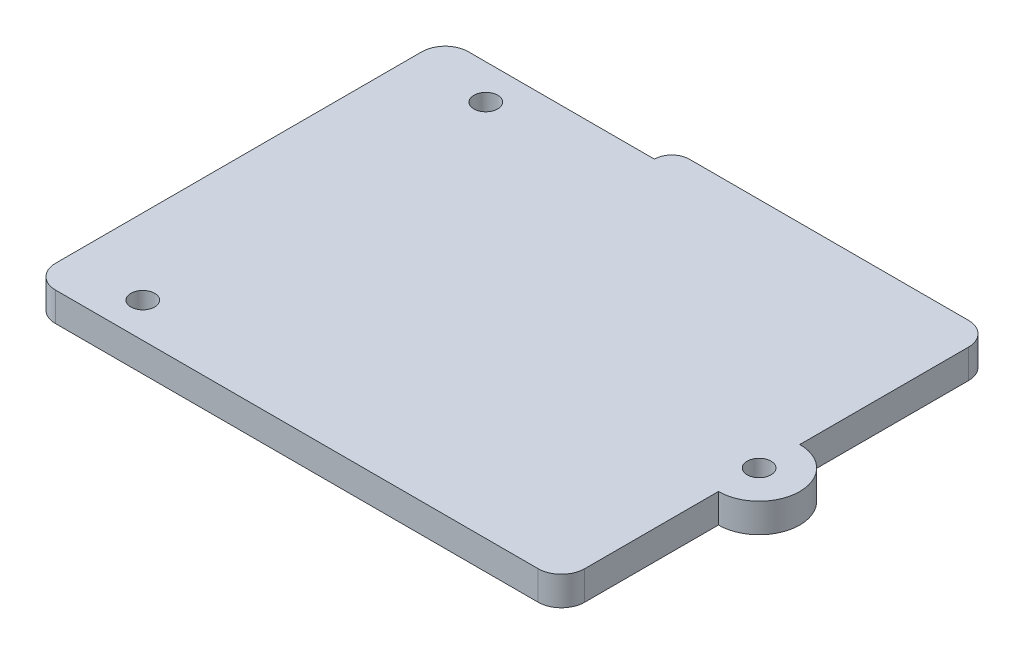
ISO-10303-21;
HEADER;
FILE_DESCRIPTION(('STEP AP214'),'2;1');
FILE_NAME('part.step','',(''),(''),'','','');
FILE_SCHEMA(('AUTOMOTIVE_DESIGN { 1 0 10303 214 1 1 1 1 }'));
ENDSEC;
DATA;
#1=APPLICATION_CONTEXT('core data for automotive mechanical design processes');
#2=APPLICATION_PROTOCOL_DEFINITION('international standard','automotive_design',2000,#1);
#3=PRODUCT_CONTEXT('',#1,'mechanical');
#4=PRODUCT('Part','Part','',(#3));
#5=PRODUCT_RELATED_PRODUCT_CATEGORY('part','',(#4));
#6=PRODUCT_DEFINITION_FORMATION('','',#4);
#7=PRODUCT_DEFINITION_CONTEXT('part definition',#1,'design');
#8=PRODUCT_DEFINITION('design','',#6,#7);
#9=PRODUCT_DEFINITION_SHAPE('','',#8);
#10=(LENGTH_UNIT() NAMED_UNIT(*) SI_UNIT(.MILLI.,.METRE.));
#11=(NAMED_UNIT(*) PLANE_ANGLE_UNIT() SI_UNIT($,.RADIAN.));
#12=(NAMED_UNIT(*) SI_UNIT($,.STERADIAN.) SOLID_ANGLE_UNIT());
#13=UNCERTAINTY_MEASURE_WITH_UNIT(LENGTH_MEASURE(1.E-05),#10,'distance_accuracy_value','');
#14=(GEOMETRIC_REPRESENTATION_CONTEXT(3) GLOBAL_UNCERTAINTY_ASSIGNED_CONTEXT((#13)) GLOBAL_UNIT_ASSIGNED_CONTEXT((#10,
#11,#12)) REPRESENTATION_CONTEXT('',''));
#15=CARTESIAN_POINT('',(0.,0.,0.));
#16=DIRECTION('',(0.,0.,1.));
#17=DIRECTION('',(1.,0.,0.));
#18=AXIS2_PLACEMENT_3D('',#15,#16,#17);
#19=CARTESIAN_POINT('',(45.5,2.5,-17.));
#20=DIRECTION('',(0.,1.,0.));
#21=DIRECTION('',(0.,0.,1.));
#22=AXIS2_PLACEMENT_3D('',#19,#20,#21);
#23=PLANE('',#22);
#24=CARTESIAN_POINT('',(6.5,2.5,-32.5));
#25=DIRECTION('',(0.,1.,0.));
#26=DIRECTION('',(0.,0.,1.));
#27=AXIS2_PLACEMENT_3D('',#24,#25,#26);
#28=CIRCLE('',#27,1.02499999999999);
#29=CARTESIAN_POINT('',(6.5,2.5,-31.475));
#30=VERTEX_POINT('',#29);
#31=EDGE_CURVE('E359',#30,#30,#28,.T.);
#32=ORIENTED_EDGE('',*,*,#31,.F.);
#33=EDGE_LOOP('',(#32));
#34=FACE_BOUND('',#33,.T.);
#35=CARTESIAN_POINT('',(6.5,2.5,-3.));
#36=DIRECTION('',(0.,1.,0.));
#37=DIRECTION('',(0.,0.,1.));
#38=AXIS2_PLACEMENT_3D('',#35,#36,#37);
#39=CIRCLE('',#38,1.02499999999999);
#40=CARTESIAN_POINT('',(6.5,2.5,-1.97500000000001));
#41=VERTEX_POINT('',#40);
#42=EDGE_CURVE('E353',#41,#41,#39,.T.);
#43=ORIENTED_EDGE('',*,*,#42,.F.);
#44=EDGE_LOOP('',(#43));
#45=FACE_BOUND('',#44,.T.);
#46=CARTESIAN_POINT('',(45.5,2.5,-17.));
#47=DIRECTION('',(0.,1.,0.));
#48=DIRECTION('',(0.,0.,1.));
#49=AXIS2_PLACEMENT_3D('',#46,#47,#48);
#50=CIRCLE('',#49,1.02499999999998);
#51=CARTESIAN_POINT('',(45.5,2.5,-15.975));
#52=VERTEX_POINT('',#51);
#53=EDGE_CURVE('E346',#52,#52,#50,.T.);
#54=ORIENTED_EDGE('',*,*,#53,.F.);
#55=EDGE_LOOP('',(#54));
#56=FACE_BOUND('',#55,.T.);
#57=DIRECTION('',(-1.,0.,0.));
#58=VECTOR('',#57,1.);
#59=CARTESIAN_POINT('',(45.5,2.5,-37.));
#60=LINE('',#59,#58);
#61=CARTESIAN_POINT('',(43.5,2.5,-37.));
#62=VERTEX_POINT('',#61);
#63=CARTESIAN_POINT('',(19.5,2.5,-37.));
#64=VERTEX_POINT('',#63);
#65=EDGE_CURVE('E245',#62,#64,#60,.T.);
#66=ORIENTED_EDGE('',*,*,#65,.T.);
#67=CARTESIAN_POINT('',(19.5,2.5,-35.5));
#68=DIRECTION('',(0.,1.,0.));
#69=DIRECTION('',(0.,0.,1.));
#70=AXIS2_PLACEMENT_3D('',#67,#68,#69);
#71=CIRCLE('',#70,1.5);
#72=CARTESIAN_POINT('',(18.,2.5,-35.5));
#73=VERTEX_POINT('',#72);
#74=EDGE_CURVE('E12',#64,#73,#71,.T.);
#75=ORIENTED_EDGE('',*,*,#74,.T.);
#76=DIRECTION('',(-1.,0.,0.));
#77=VECTOR('',#76,1.);
#78=CARTESIAN_POINT('',(18.,2.5,-35.5));
#79=LINE('',#78,#77);
#80=CARTESIAN_POINT('',(2.,2.5,-35.5));
#81=VERTEX_POINT('',#80);
#82=EDGE_CURVE('E250',#73,#81,#79,.T.);
#83=ORIENTED_EDGE('',*,*,#82,.T.);
#84=CARTESIAN_POINT('',(2.,2.5,-33.5));
#85=DIRECTION('',(0.,1.,0.));
#86=DIRECTION('',(0.,0.,1.));
#87=AXIS2_PLACEMENT_3D('',#84,#85,#86);
#88=CIRCLE('',#87,2.);
#89=CARTESIAN_POINT('',(0.,2.5,-33.5));
#90=VERTEX_POINT('',#89);
#91=EDGE_CURVE('E290',#81,#90,#88,.T.);
#92=ORIENTED_EDGE('',*,*,#91,.T.);
#93=DIRECTION('',(0.,0.,1.));
#94=VECTOR('',#93,1.);
#95=CARTESIAN_POINT('',(0.,2.5,-35.5));
#96=LINE('',#95,#94);
#97=CARTESIAN_POINT('',(0.,2.5,-2.));
#98=VERTEX_POINT('',#97);
#99=EDGE_CURVE('E273',#90,#98,#96,.T.);
#100=ORIENTED_EDGE('',*,*,#99,.T.);
#101=CARTESIAN_POINT('',(2.,2.5,-2.));
#102=DIRECTION('',(0.,1.,0.));
#103=DIRECTION('',(0.,0.,1.));
#104=AXIS2_PLACEMENT_3D('',#101,#102,#103);
#105=CIRCLE('',#104,2.);
#106=CARTESIAN_POINT('',(2.,2.5,0.));
#107=VERTEX_POINT('',#106);
#108=EDGE_CURVE('E292',#98,#107,#105,.T.);
#109=ORIENTED_EDGE('',*,*,#108,.T.);
#110=DIRECTION('',(1.,0.,0.));
#111=VECTOR('',#110,1.);
#112=CARTESIAN_POINT('',(0.,2.5,0.));
#113=LINE('',#112,#111);
#114=CARTESIAN_POINT('',(43.5,2.5,0.));
#115=VERTEX_POINT('',#114);
#116=EDGE_CURVE('E225',#107,#115,#113,.T.);
#117=ORIENTED_EDGE('',*,*,#116,.T.);
#118=CARTESIAN_POINT('',(43.5,2.5,-2.));
#119=DIRECTION('',(0.,1.,0.));
#120=DIRECTION('',(0.,0.,1.));
#121=AXIS2_PLACEMENT_3D('',#118,#119,#120);
#122=CIRCLE('',#121,2.);
#123=CARTESIAN_POINT('',(45.5,2.5,-2.));
#124=VERTEX_POINT('',#123);
#125=EDGE_CURVE('E221',#115,#124,#122,.T.);
#126=ORIENTED_EDGE('',*,*,#125,.T.);
#127=DIRECTION('',(0.,0.,-1.));
#128=VECTOR('',#127,1.);
#129=CARTESIAN_POINT('',(45.5,2.5,0.));
#130=LINE('',#129,#128);
#131=CARTESIAN_POINT('',(45.5,2.5,-13.5));
#132=VERTEX_POINT('',#131);
#133=EDGE_CURVE('E213',#124,#132,#130,.T.);
#134=ORIENTED_EDGE('',*,*,#133,.T.);
#135=CARTESIAN_POINT('',(45.5,2.5,-17.));
#136=DIRECTION('',(0.,1.,0.));
#137=DIRECTION('',(0.,0.,1.));
#138=AXIS2_PLACEMENT_3D('',#135,#136,#137);
#139=CIRCLE('',#138,3.5);
#140=CARTESIAN_POINT('',(45.5,2.5,-20.5));
#141=VERTEX_POINT('',#140);
#142=EDGE_CURVE('E217',#132,#141,#139,.T.);
#143=ORIENTED_EDGE('',*,*,#142,.T.);
#144=DIRECTION('',(0.,0.,-1.));
#145=VECTOR('',#144,1.);
#146=CARTESIAN_POINT('',(45.5,2.5,-20.5));
#147=LINE('',#146,#145);
#148=CARTESIAN_POINT('',(45.5,2.5,-35.));
#149=VERTEX_POINT('',#148);
#150=EDGE_CURVE('E241',#141,#149,#147,.T.);
#151=ORIENTED_EDGE('',*,*,#150,.T.);
#152=CARTESIAN_POINT('',(43.5,2.5,-35.));
#153=DIRECTION('',(0.,1.,0.));
#154=DIRECTION('',(0.,0.,1.));
#155=AXIS2_PLACEMENT_3D('',#152,#153,#154);
#156=CIRCLE('',#155,2.);
#157=EDGE_CURVE('E296',#149,#62,#156,.T.);
#158=ORIENTED_EDGE('',*,*,#157,.T.);
#159=EDGE_LOOP('',(#66,#75,#83,#92,#100,#109,#117,#126,#134,#143,#151,#158));
#160=FACE_BOUND('',#159,.T.);
#161=ADVANCED_FACE('F121',(#34,#45,#56,#160),#23,.T.);
#162=CARTESIAN_POINT('',(45.5,0.,-17.));
#163=DIRECTION('',(0.,1.,0.));
#164=DIRECTION('',(0.,0.,1.));
#165=AXIS2_PLACEMENT_3D('',#162,#163,#164);
#166=PLANE('',#165);
#167=CARTESIAN_POINT('',(6.5,0.,-32.5));
#168=DIRECTION('',(0.,1.,0.));
#169=DIRECTION('',(0.,0.,1.));
#170=AXIS2_PLACEMENT_3D('',#167,#168,#169);
#171=CIRCLE('',#170,1.025);
#172=CARTESIAN_POINT('',(6.5,0.,-31.475));
#173=VERTEX_POINT('',#172);
#174=EDGE_CURVE('E356',#173,#173,#171,.T.);
#175=ORIENTED_EDGE('',*,*,#174,.T.);
#176=EDGE_LOOP('',(#175));
#177=FACE_BOUND('',#176,.T.);
#178=CARTESIAN_POINT('',(6.5,0.,-3.));
#179=DIRECTION('',(0.,1.,0.));
#180=DIRECTION('',(0.,0.,1.));
#181=AXIS2_PLACEMENT_3D('',#178,#179,#180);
#182=CIRCLE('',#181,1.025);
#183=CARTESIAN_POINT('',(6.5,0.,-1.975));
#184=VERTEX_POINT('',#183);
#185=EDGE_CURVE('E349',#184,#184,#182,.T.);
#186=ORIENTED_EDGE('',*,*,#185,.T.);
#187=EDGE_LOOP('',(#186));
#188=FACE_BOUND('',#187,.T.);
#189=CARTESIAN_POINT('',(45.5,0.,-17.));
#190=DIRECTION('',(0.,1.,0.));
#191=DIRECTION('',(0.,0.,1.));
#192=AXIS2_PLACEMENT_3D('',#189,#190,#191);
#193=CIRCLE('',#192,1.025);
#194=CARTESIAN_POINT('',(45.5,0.,-15.975));
#195=VERTEX_POINT('',#194);
#196=EDGE_CURVE('E258',#195,#195,#193,.T.);
#197=ORIENTED_EDGE('',*,*,#196,.T.);
#198=EDGE_LOOP('',(#197));
#199=FACE_BOUND('',#198,.T.);
#200=DIRECTION('',(-1.,0.,0.));
#201=VECTOR('',#200,1.);
#202=CARTESIAN_POINT('',(18.,0.,-35.5));
#203=LINE('',#202,#201);
#204=CARTESIAN_POINT('',(18.,0.,-35.5));
#205=VERTEX_POINT('',#204);
#206=CARTESIAN_POINT('',(2.,0.,-35.5));
#207=VERTEX_POINT('',#206);
#208=EDGE_CURVE('E270',#205,#207,#203,.T.);
#209=ORIENTED_EDGE('',*,*,#208,.F.);
#210=CARTESIAN_POINT('',(19.5,0.,-35.5));
#211=DIRECTION('',(0.,1.,0.));
#212=DIRECTION('',(0.,0.,1.));
#213=AXIS2_PLACEMENT_3D('',#210,#211,#212);
#214=CIRCLE('',#213,1.5);
#215=CARTESIAN_POINT('',(19.5,0.,-37.));
#216=VERTEX_POINT('',#215);
#217=EDGE_CURVE('E143',#205,#216,#214,.F.);
#218=ORIENTED_EDGE('',*,*,#217,.T.);
#219=DIRECTION('',(-1.,0.,0.));
#220=VECTOR('',#219,1.);
#221=CARTESIAN_POINT('',(45.5,0.,-37.));
#222=LINE('',#221,#220);
#223=CARTESIAN_POINT('',(43.5,0.,-37.));
#224=VERTEX_POINT('',#223);
#225=EDGE_CURVE('E268',#224,#216,#222,.T.);
#226=ORIENTED_EDGE('',*,*,#225,.F.);
#227=CARTESIAN_POINT('',(43.5,0.,-35.));
#228=DIRECTION('',(0.,1.,0.));
#229=DIRECTION('',(0.,0.,1.));
#230=AXIS2_PLACEMENT_3D('',#227,#228,#229);
#231=CIRCLE('',#230,2.);
#232=CARTESIAN_POINT('',(45.5,0.,-35.));
#233=VERTEX_POINT('',#232);
#234=EDGE_CURVE('E286',#224,#233,#231,.F.);
#235=ORIENTED_EDGE('',*,*,#234,.T.);
#236=DIRECTION('',(0.,0.,-1.));
#237=VECTOR('',#236,1.);
#238=CARTESIAN_POINT('',(45.5,0.,-20.5));
#239=LINE('',#238,#237);
#240=CARTESIAN_POINT('',(45.5,0.,-20.5));
#241=VERTEX_POINT('',#240);
#242=EDGE_CURVE('E265',#241,#233,#239,.T.);
#243=ORIENTED_EDGE('',*,*,#242,.F.);
#244=CARTESIAN_POINT('',(45.5,0.,-17.));
#245=DIRECTION('',(0.,1.,0.));
#246=DIRECTION('',(0.,0.,1.));
#247=AXIS2_PLACEMENT_3D('',#244,#245,#246);
#248=CIRCLE('',#247,3.5);
#249=CARTESIAN_POINT('',(45.5,0.,-13.5));
#250=VERTEX_POINT('',#249);
#251=EDGE_CURVE('E263',#250,#241,#248,.T.);
#252=ORIENTED_EDGE('',*,*,#251,.F.);
#253=DIRECTION('',(0.,0.,-1.));
#254=VECTOR('',#253,1.);
#255=CARTESIAN_POINT('',(45.5,0.,0.));
#256=LINE('',#255,#254);
#257=CARTESIAN_POINT('',(45.5,0.,-2.));
#258=VERTEX_POINT('',#257);
#259=EDGE_CURVE('E231',#258,#250,#256,.T.);
#260=ORIENTED_EDGE('',*,*,#259,.F.);
#261=CARTESIAN_POINT('',(43.5,0.,-2.));
#262=DIRECTION('',(0.,1.,0.));
#263=DIRECTION('',(0.,0.,1.));
#264=AXIS2_PLACEMENT_3D('',#261,#262,#263);
#265=CIRCLE('',#264,2.);
#266=CARTESIAN_POINT('',(43.5,0.,0.));
#267=VERTEX_POINT('',#266);
#268=EDGE_CURVE('E284',#258,#267,#265,.F.);
#269=ORIENTED_EDGE('',*,*,#268,.T.);
#270=DIRECTION('',(1.,0.,0.));
#271=VECTOR('',#270,1.);
#272=CARTESIAN_POINT('',(0.,0.,0.));
#273=LINE('',#272,#271);
#274=CARTESIAN_POINT('',(2.,0.,0.));
#275=VERTEX_POINT('',#274);
#276=EDGE_CURVE('E257',#275,#267,#273,.T.);
#277=ORIENTED_EDGE('',*,*,#276,.F.);
#278=CARTESIAN_POINT('',(2.,0.,-2.));
#279=DIRECTION('',(0.,1.,0.));
#280=DIRECTION('',(0.,0.,1.));
#281=AXIS2_PLACEMENT_3D('',#278,#279,#280);
#282=CIRCLE('',#281,2.);
#283=CARTESIAN_POINT('',(0.,0.,-2.));
#284=VERTEX_POINT('',#283);
#285=EDGE_CURVE('E281',#275,#284,#282,.F.);
#286=ORIENTED_EDGE('',*,*,#285,.T.);
#287=DIRECTION('',(0.,0.,1.));
#288=VECTOR('',#287,1.);
#289=CARTESIAN_POINT('',(0.,0.,-35.5));
#290=LINE('',#289,#288);
#291=CARTESIAN_POINT('',(0.,0.,-33.5));
#292=VERTEX_POINT('',#291);
#293=EDGE_CURVE('E254',#292,#284,#290,.T.);
#294=ORIENTED_EDGE('',*,*,#293,.F.);
#295=CARTESIAN_POINT('',(2.,0.,-33.5));
#296=DIRECTION('',(0.,1.,0.));
#297=DIRECTION('',(0.,0.,1.));
#298=AXIS2_PLACEMENT_3D('',#295,#296,#297);
#299=CIRCLE('',#298,2.);
#300=EDGE_CURVE('E279',#292,#207,#299,.F.);
#301=ORIENTED_EDGE('',*,*,#300,.T.);
#302=EDGE_LOOP('',(#209,#218,#226,#235,#243,#252,#260,#269,#277,#286,#294,#301));
#303=FACE_BOUND('',#302,.T.);
#304=ADVANCED_FACE('F329',(#177,#188,#199,#303),#166,.F.);
#305=CARTESIAN_POINT('',(0.,2.5,-35.5));
#306=DIRECTION('',(1.,0.,0.));
#307=DIRECTION('',(0.,0.,-1.));
#308=AXIS2_PLACEMENT_3D('',#305,#306,#307);
#309=PLANE('',#308);
#310=ORIENTED_EDGE('',*,*,#293,.T.);
#311=DIRECTION('',(0.,-1.,0.));
#312=VECTOR('',#311,1.);
#313=CARTESIAN_POINT('',(0.,2.5,-2.));
#314=LINE('',#313,#312);
#315=EDGE_CURVE('E309',#284,#98,#314,.F.);
#316=ORIENTED_EDGE('',*,*,#315,.T.);
#317=ORIENTED_EDGE('',*,*,#99,.F.);
#318=DIRECTION('',(0.,-1.,0.));
#319=VECTOR('',#318,1.);
#320=CARTESIAN_POINT('',(0.,2.5,-33.5));
#321=LINE('',#320,#319);
#322=EDGE_CURVE('E306',#90,#292,#321,.T.);
#323=ORIENTED_EDGE('',*,*,#322,.T.);
#324=EDGE_LOOP('',(#310,#316,#317,#323));
#325=FACE_BOUND('',#324,.T.);
#326=ADVANCED_FACE('F327',(#325),#309,.F.);
#327=CARTESIAN_POINT('',(0.,2.5,0.));
#328=DIRECTION('',(0.,0.,-1.));
#329=DIRECTION('',(-1.,0.,0.));
#330=AXIS2_PLACEMENT_3D('',#327,#328,#329);
#331=PLANE('',#330);
#332=ORIENTED_EDGE('',*,*,#276,.T.);
#333=DIRECTION('',(0.,-1.,0.));
#334=VECTOR('',#333,1.);
#335=CARTESIAN_POINT('',(43.5,2.5,0.));
#336=LINE('',#335,#334);
#337=EDGE_CURVE('E304',#267,#115,#336,.F.);
#338=ORIENTED_EDGE('',*,*,#337,.T.);
#339=ORIENTED_EDGE('',*,*,#116,.F.);
#340=DIRECTION('',(0.,-1.,0.));
#341=VECTOR('',#340,1.);
#342=CARTESIAN_POINT('',(2.,2.5,0.));
#343=LINE('',#342,#341);
#344=EDGE_CURVE('E300',#107,#275,#343,.T.);
#345=ORIENTED_EDGE('',*,*,#344,.T.);
#346=EDGE_LOOP('',(#332,#338,#339,#345));
#347=FACE_BOUND('',#346,.T.);
#348=ADVANCED_FACE('F337',(#347),#331,.F.);
#349=CARTESIAN_POINT('',(45.5,2.5,0.));
#350=DIRECTION('',(-1.,0.,0.));
#351=DIRECTION('',(0.,0.,1.));
#352=AXIS2_PLACEMENT_3D('',#349,#350,#351);
#353=PLANE('',#352);
#354=ORIENTED_EDGE('',*,*,#133,.F.);
#355=DIRECTION('',(0.,-1.,0.));
#356=VECTOR('',#355,1.);
#357=CARTESIAN_POINT('',(45.5,2.5,-2.));
#358=LINE('',#357,#356);
#359=EDGE_CURVE('E298',#124,#258,#358,.T.);
#360=ORIENTED_EDGE('',*,*,#359,.T.);
#361=ORIENTED_EDGE('',*,*,#259,.T.);
#362=DIRECTION('',(0.,-1.,0.));
#363=VECTOR('',#362,1.);
#364=CARTESIAN_POINT('',(45.5,2.5,-13.5));
#365=LINE('',#364,#363);
#366=EDGE_CURVE('E228',#132,#250,#365,.T.);
#367=ORIENTED_EDGE('',*,*,#366,.F.);
#368=EDGE_LOOP('',(#354,#360,#361,#367));
#369=FACE_BOUND('',#368,.T.);
#370=ADVANCED_FACE('F229',(#369),#353,.F.);
#371=CARTESIAN_POINT('',(45.5,2.5,-17.));
#372=DIRECTION('',(0.,-1.,0.));
#373=DIRECTION('',(0.,0.,-1.));
#374=AXIS2_PLACEMENT_3D('',#371,#372,#373);
#375=CYLINDRICAL_SURFACE('',#374,3.5);
#376=ORIENTED_EDGE('',*,*,#251,.T.);
#377=DIRECTION('',(0.,-1.,0.));
#378=VECTOR('',#377,1.);
#379=CARTESIAN_POINT('',(45.5,2.5,-20.5));
#380=LINE('',#379,#378);
#381=EDGE_CURVE('E235',#141,#241,#380,.T.);
#382=ORIENTED_EDGE('',*,*,#381,.F.);
#383=ORIENTED_EDGE('',*,*,#142,.F.);
#384=ORIENTED_EDGE('',*,*,#366,.T.);
#385=EDGE_LOOP('',(#376,#382,#383,#384));
#386=FACE_BOUND('',#385,.T.);
#387=ADVANCED_FACE('F237',(#386),#375,.T.);
#388=CARTESIAN_POINT('',(45.5,2.5,-20.5));
#389=DIRECTION('',(-1.,0.,0.));
#390=DIRECTION('',(0.,0.,1.));
#391=AXIS2_PLACEMENT_3D('',#388,#389,#390);
#392=PLANE('',#391);
#393=ORIENTED_EDGE('',*,*,#242,.T.);
#394=DIRECTION('',(0.,-1.,0.));
#395=VECTOR('',#394,1.);
#396=CARTESIAN_POINT('',(45.5,2.5,-35.));
#397=LINE('',#396,#395);
#398=EDGE_CURVE('E288',#233,#149,#397,.F.);
#399=ORIENTED_EDGE('',*,*,#398,.T.);
#400=ORIENTED_EDGE('',*,*,#150,.F.);
#401=ORIENTED_EDGE('',*,*,#381,.T.);
#402=EDGE_LOOP('',(#393,#399,#400,#401));
#403=FACE_BOUND('',#402,.T.);
#404=ADVANCED_FACE('F396',(#403),#392,.F.);
#405=CARTESIAN_POINT('',(45.5,2.5,-37.));
#406=DIRECTION('',(0.,0.,1.));
#407=DIRECTION('',(1.,0.,0.));
#408=AXIS2_PLACEMENT_3D('',#405,#406,#407);
#409=PLANE('',#408);
#410=ORIENTED_EDGE('',*,*,#225,.T.);
#411=DIRECTION('',(0.,-1.,0.));
#412=VECTOR('',#411,1.);
#413=CARTESIAN_POINT('',(19.5,2.5,-37.));
#414=LINE('',#413,#412);
#415=EDGE_CURVE('E129',#216,#64,#414,.F.);
#416=ORIENTED_EDGE('',*,*,#415,.T.);
#417=ORIENTED_EDGE('',*,*,#65,.F.);
#418=DIRECTION('',(0.,-1.,0.));
#419=VECTOR('',#418,1.);
#420=CARTESIAN_POINT('',(43.5,2.5,-37.));
#421=LINE('',#420,#419);
#422=EDGE_CURVE('E234',#62,#224,#421,.T.);
#423=ORIENTED_EDGE('',*,*,#422,.T.);
#424=EDGE_LOOP('',(#410,#416,#417,#423));
#425=FACE_BOUND('',#424,.T.);
#426=ADVANCED_FACE('F393',(#425),#409,.F.);
#427=CARTESIAN_POINT('',(18.,2.5,-35.5));
#428=DIRECTION('',(0.,0.,1.));
#429=DIRECTION('',(1.,0.,0.));
#430=AXIS2_PLACEMENT_3D('',#427,#428,#429);
#431=PLANE('',#430);
#432=ORIENTED_EDGE('',*,*,#208,.T.);
#433=DIRECTION('',(0.,-1.,0.));
#434=VECTOR('',#433,1.);
#435=CARTESIAN_POINT('',(2.,2.5,-35.5));
#436=LINE('',#435,#434);
#437=EDGE_CURVE('E311',#207,#81,#436,.F.);
#438=ORIENTED_EDGE('',*,*,#437,.T.);
#439=ORIENTED_EDGE('',*,*,#82,.F.);
#440=DIRECTION('',(0.,-1.,0.));
#441=VECTOR('',#440,1.);
#442=CARTESIAN_POINT('',(18.,2.5,-35.5));
#443=LINE('',#442,#441);
#444=EDGE_CURVE('E253',#73,#205,#443,.T.);
#445=ORIENTED_EDGE('',*,*,#444,.T.);
#446=EDGE_LOOP('',(#432,#438,#439,#445));
#447=FACE_BOUND('',#446,.T.);
#448=ADVANCED_FACE('F316',(#447),#431,.F.);
#449=CARTESIAN_POINT('',(43.5,2.5,-35.));
#450=DIRECTION('',(0.,-1.,0.));
#451=DIRECTION('',(0.,0.,-1.));
#452=AXIS2_PLACEMENT_3D('',#449,#450,#451);
#453=CYLINDRICAL_SURFACE('',#452,2.);
#454=ORIENTED_EDGE('',*,*,#157,.F.);
#455=ORIENTED_EDGE('',*,*,#398,.F.);
#456=ORIENTED_EDGE('',*,*,#234,.F.);
#457=ORIENTED_EDGE('',*,*,#422,.F.);
#458=EDGE_LOOP('',(#454,#455,#456,#457));
#459=FACE_BOUND('',#458,.T.);
#460=ADVANCED_FACE('F392',(#459),#453,.T.);
#461=CARTESIAN_POINT('',(43.5,2.5,-2.));
#462=DIRECTION('',(0.,-1.,0.));
#463=DIRECTION('',(0.,0.,-1.));
#464=AXIS2_PLACEMENT_3D('',#461,#462,#463);
#465=CYLINDRICAL_SURFACE('',#464,2.);
#466=ORIENTED_EDGE('',*,*,#125,.F.);
#467=ORIENTED_EDGE('',*,*,#337,.F.);
#468=ORIENTED_EDGE('',*,*,#268,.F.);
#469=ORIENTED_EDGE('',*,*,#359,.F.);
#470=EDGE_LOOP('',(#466,#467,#468,#469));
#471=FACE_BOUND('',#470,.T.);
#472=ADVANCED_FACE('F410',(#471),#465,.T.);
#473=CARTESIAN_POINT('',(2.,2.5,-2.));
#474=DIRECTION('',(0.,-1.,0.));
#475=DIRECTION('',(0.,0.,-1.));
#476=AXIS2_PLACEMENT_3D('',#473,#474,#475);
#477=CYLINDRICAL_SURFACE('',#476,2.);
#478=ORIENTED_EDGE('',*,*,#108,.F.);
#479=ORIENTED_EDGE('',*,*,#315,.F.);
#480=ORIENTED_EDGE('',*,*,#285,.F.);
#481=ORIENTED_EDGE('',*,*,#344,.F.);
#482=EDGE_LOOP('',(#478,#479,#480,#481));
#483=FACE_BOUND('',#482,.T.);
#484=ADVANCED_FACE('F334',(#483),#477,.T.);
#485=CARTESIAN_POINT('',(2.,2.5,-33.5));
#486=DIRECTION('',(0.,-1.,0.));
#487=DIRECTION('',(0.,0.,-1.));
#488=AXIS2_PLACEMENT_3D('',#485,#486,#487);
#489=CYLINDRICAL_SURFACE('',#488,2.);
#490=ORIENTED_EDGE('',*,*,#91,.F.);
#491=ORIENTED_EDGE('',*,*,#437,.F.);
#492=ORIENTED_EDGE('',*,*,#300,.F.);
#493=ORIENTED_EDGE('',*,*,#322,.F.);
#494=EDGE_LOOP('',(#490,#491,#492,#493));
#495=FACE_BOUND('',#494,.T.);
#496=ADVANCED_FACE('F324',(#495),#489,.T.);
#497=CARTESIAN_POINT('',(19.5,2.5,-35.5));
#498=DIRECTION('',(0.,-1.,0.));
#499=DIRECTION('',(0.,0.,-1.));
#500=AXIS2_PLACEMENT_3D('',#497,#498,#499);
#501=CYLINDRICAL_SURFACE('',#500,1.5);
#502=ORIENTED_EDGE('',*,*,#74,.F.);
#503=ORIENTED_EDGE('',*,*,#415,.F.);
#504=ORIENTED_EDGE('',*,*,#217,.F.);
#505=ORIENTED_EDGE('',*,*,#444,.F.);
#506=EDGE_LOOP('',(#502,#503,#504,#505));
#507=FACE_BOUND('',#506,.T.);
#508=ADVANCED_FACE('F123',(#507),#501,.T.);
#509=CARTESIAN_POINT('',(45.5,2.5,-17.));
#510=DIRECTION('',(0.,1.,0.));
#511=DIRECTION('',(0.,0.,1.));
#512=AXIS2_PLACEMENT_3D('',#509,#510,#511);
#513=CYLINDRICAL_SURFACE('',#512,1.02499999999999);
#514=ORIENTED_EDGE('',*,*,#196,.F.);
#515=EDGE_LOOP('',(#514));
#516=FACE_BOUND('',#515,.T.);
#517=ORIENTED_EDGE('',*,*,#53,.T.);
#518=EDGE_LOOP('',(#517));
#519=FACE_BOUND('',#518,.T.);
#520=ADVANCED_FACE('F372',(#516,#519),#513,.F.);
#521=CARTESIAN_POINT('',(6.5,2.5,-3.));
#522=DIRECTION('',(0.,1.,0.));
#523=DIRECTION('',(0.,0.,1.));
#524=AXIS2_PLACEMENT_3D('',#521,#522,#523);
#525=CYLINDRICAL_SURFACE('',#524,1.02499999999999);
#526=ORIENTED_EDGE('',*,*,#185,.F.);
#527=EDGE_LOOP('',(#526));
#528=FACE_BOUND('',#527,.T.);
#529=ORIENTED_EDGE('',*,*,#42,.T.);
#530=EDGE_LOOP('',(#529));
#531=FACE_BOUND('',#530,.T.);
#532=ADVANCED_FACE('F374',(#528,#531),#525,.F.);
#533=CARTESIAN_POINT('',(6.5,2.5,-32.5));
#534=DIRECTION('',(0.,1.,0.));
#535=DIRECTION('',(0.,0.,1.));
#536=AXIS2_PLACEMENT_3D('',#533,#534,#535);
#537=CYLINDRICAL_SURFACE('',#536,1.02499999999999);
#538=ORIENTED_EDGE('',*,*,#174,.F.);
#539=EDGE_LOOP('',(#538));
#540=FACE_BOUND('',#539,.T.);
#541=ORIENTED_EDGE('',*,*,#31,.T.);
#542=EDGE_LOOP('',(#541));
#543=FACE_BOUND('',#542,.T.);
#544=ADVANCED_FACE('F363',(#540,#543),#537,.F.);
#545=CLOSED_SHELL('',(#161,#304,#326,#348,#370,#387,#404,#426,#448,#460,#472,#484,#496,#508,
#520,#532,#544));
#546=MANIFOLD_SOLID_BREP('B2',#545);
#547=ADVANCED_BREP_SHAPE_REPRESENTATION('',(#18,#546),#14);
#548=SHAPE_DEFINITION_REPRESENTATION(#9,#547);
ENDSEC;
END-ISO-10303-21;
